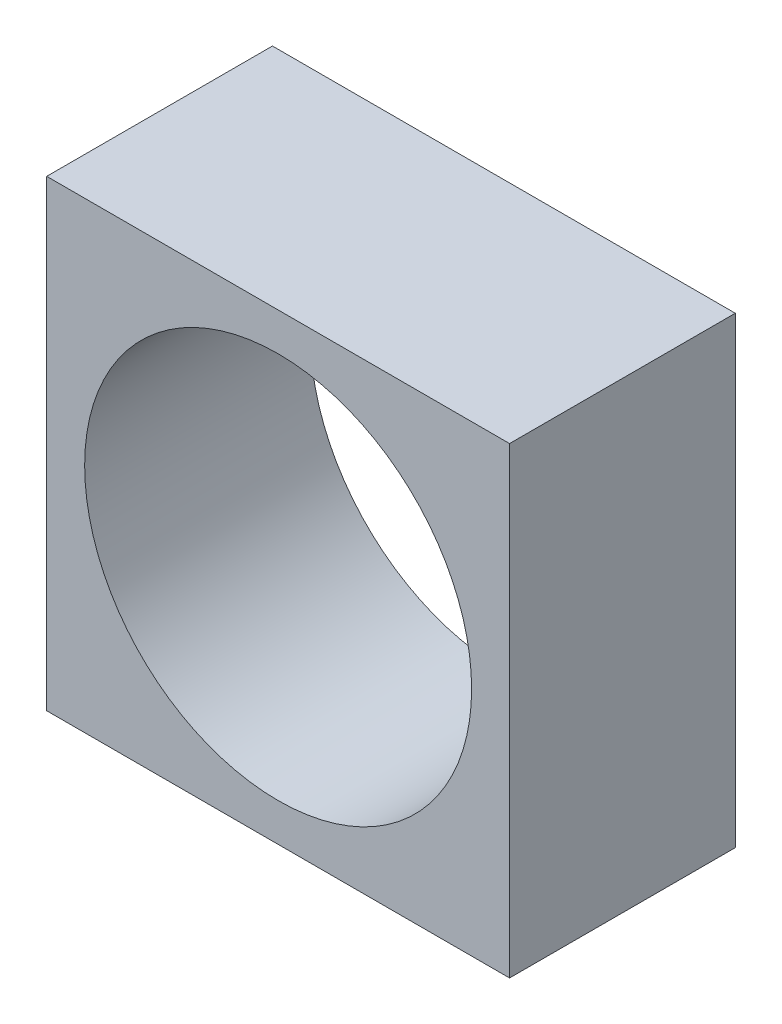
ISO-10303-21;
HEADER;
FILE_DESCRIPTION(('STEP AP214'),'2;1');
FILE_NAME('part.step','',(''),(''),'','','');
FILE_SCHEMA(('AUTOMOTIVE_DESIGN { 1 0 10303 214 1 1 1 1 }'));
ENDSEC;
DATA;
#1=APPLICATION_CONTEXT('core data for automotive mechanical design processes');
#2=APPLICATION_PROTOCOL_DEFINITION('international standard','automotive_design',2000,#1);
#3=PRODUCT_CONTEXT('',#1,'mechanical');
#4=PRODUCT('Part','Part','',(#3));
#5=PRODUCT_RELATED_PRODUCT_CATEGORY('part','',(#4));
#6=PRODUCT_DEFINITION_FORMATION('','',#4);
#7=PRODUCT_DEFINITION_CONTEXT('part definition',#1,'design');
#8=PRODUCT_DEFINITION('design','',#6,#7);
#9=PRODUCT_DEFINITION_SHAPE('','',#8);
#10=(LENGTH_UNIT() NAMED_UNIT(*) SI_UNIT(.MILLI.,.METRE.));
#11=(NAMED_UNIT(*) PLANE_ANGLE_UNIT() SI_UNIT($,.RADIAN.));
#12=(NAMED_UNIT(*) SI_UNIT($,.STERADIAN.) SOLID_ANGLE_UNIT());
#13=UNCERTAINTY_MEASURE_WITH_UNIT(LENGTH_MEASURE(1.E-05),#10,'distance_accuracy_value','');
#14=(GEOMETRIC_REPRESENTATION_CONTEXT(3) GLOBAL_UNCERTAINTY_ASSIGNED_CONTEXT((#13)) GLOBAL_UNIT_ASSIGNED_CONTEXT((#10,
#11,#12)) REPRESENTATION_CONTEXT('',''));
#15=CARTESIAN_POINT('',(0.,0.,0.));
#16=DIRECTION('',(0.,0.,1.));
#17=DIRECTION('',(1.,0.,0.));
#18=AXIS2_PLACEMENT_3D('',#15,#16,#17);
#19=CARTESIAN_POINT('',(0.,0.,2.975));
#20=DIRECTION('',(1.,0.,0.));
#21=DIRECTION('',(0.,0.,-1.));
#22=AXIS2_PLACEMENT_3D('',#19,#20,#21);
#23=PLANE('',#22);
#24=DIRECTION('',(0.,-1.,0.));
#25=VECTOR('',#24,1.);
#26=CARTESIAN_POINT('',(0.,0.,0.));
#27=LINE('',#26,#25);
#28=CARTESIAN_POINT('',(0.,6.1,0.));
#29=VERTEX_POINT('',#28);
#30=CARTESIAN_POINT('',(0.,0.,0.));
#31=VERTEX_POINT('',#30);
#32=EDGE_CURVE('E107',#29,#31,#27,.T.);
#33=ORIENTED_EDGE('',*,*,#32,.T.);
#34=DIRECTION('',(0.,0.,-1.));
#35=VECTOR('',#34,1.);
#36=CARTESIAN_POINT('',(0.,0.,2.975));
#37=LINE('',#36,#35);
#38=CARTESIAN_POINT('',(0.,0.,2.975));
#39=VERTEX_POINT('',#38);
#40=EDGE_CURVE('E11',#39,#31,#37,.T.);
#41=ORIENTED_EDGE('',*,*,#40,.F.);
#42=DIRECTION('',(0.,-1.,0.));
#43=VECTOR('',#42,1.);
#44=CARTESIAN_POINT('',(0.,0.,2.975));
#45=LINE('',#44,#43);
#46=CARTESIAN_POINT('',(0.,6.1,2.975));
#47=VERTEX_POINT('',#46);
#48=EDGE_CURVE('E91',#47,#39,#45,.T.);
#49=ORIENTED_EDGE('',*,*,#48,.F.);
#50=DIRECTION('',(0.,0.,-1.));
#51=VECTOR('',#50,1.);
#52=CARTESIAN_POINT('',(0.,6.1,2.975));
#53=LINE('',#52,#51);
#54=EDGE_CURVE('E103',#47,#29,#53,.T.);
#55=ORIENTED_EDGE('',*,*,#54,.T.);
#56=EDGE_LOOP('',(#33,#41,#49,#55));
#57=FACE_BOUND('',#56,.T.);
#58=ADVANCED_FACE('F39',(#57),#23,.F.);
#59=CARTESIAN_POINT('',(0.,0.,2.975));
#60=DIRECTION('',(0.,1.,0.));
#61=DIRECTION('',(0.,0.,1.));
#62=AXIS2_PLACEMENT_3D('',#59,#60,#61);
#63=PLANE('',#62);
#64=DIRECTION('',(1.,0.,0.));
#65=VECTOR('',#64,1.);
#66=CARTESIAN_POINT('',(0.,0.,0.));
#67=LINE('',#66,#65);
#68=CARTESIAN_POINT('',(6.1,0.,0.));
#69=VERTEX_POINT('',#68);
#70=EDGE_CURVE('E96',#31,#69,#67,.T.);
#71=ORIENTED_EDGE('',*,*,#70,.T.);
#72=DIRECTION('',(0.,0.,-1.));
#73=VECTOR('',#72,1.);
#74=CARTESIAN_POINT('',(6.1,0.,2.975));
#75=LINE('',#74,#73);
#76=CARTESIAN_POINT('',(6.1,0.,2.975));
#77=VERTEX_POINT('',#76);
#78=EDGE_CURVE('E48',#77,#69,#75,.T.);
#79=ORIENTED_EDGE('',*,*,#78,.F.);
#80=DIRECTION('',(1.,0.,0.));
#81=VECTOR('',#80,1.);
#82=CARTESIAN_POINT('',(0.,0.,2.975));
#83=LINE('',#82,#81);
#84=EDGE_CURVE('E86',#39,#77,#83,.T.);
#85=ORIENTED_EDGE('',*,*,#84,.F.);
#86=ORIENTED_EDGE('',*,*,#40,.T.);
#87=EDGE_LOOP('',(#71,#79,#85,#86));
#88=FACE_BOUND('',#87,.T.);
#89=ADVANCED_FACE('F95',(#88),#63,.F.);
#90=CARTESIAN_POINT('',(6.1,0.,2.975));
#91=DIRECTION('',(-1.,0.,0.));
#92=DIRECTION('',(0.,0.,1.));
#93=AXIS2_PLACEMENT_3D('',#90,#91,#92);
#94=PLANE('',#93);
#95=DIRECTION('',(0.,1.,0.));
#96=VECTOR('',#95,1.);
#97=CARTESIAN_POINT('',(6.1,0.,0.));
#98=LINE('',#97,#96);
#99=CARTESIAN_POINT('',(6.1,6.1,0.));
#100=VERTEX_POINT('',#99);
#101=EDGE_CURVE('E73',#69,#100,#98,.T.);
#102=ORIENTED_EDGE('',*,*,#101,.T.);
#103=DIRECTION('',(0.,0.,-1.));
#104=VECTOR('',#103,1.);
#105=CARTESIAN_POINT('',(6.1,6.1,2.975));
#106=LINE('',#105,#104);
#107=CARTESIAN_POINT('',(6.1,6.1,2.975));
#108=VERTEX_POINT('',#107);
#109=EDGE_CURVE('E98',#108,#100,#106,.T.);
#110=ORIENTED_EDGE('',*,*,#109,.F.);
#111=DIRECTION('',(0.,1.,0.));
#112=VECTOR('',#111,1.);
#113=CARTESIAN_POINT('',(6.1,0.,2.975));
#114=LINE('',#113,#112);
#115=EDGE_CURVE('E89',#77,#108,#114,.T.);
#116=ORIENTED_EDGE('',*,*,#115,.F.);
#117=ORIENTED_EDGE('',*,*,#78,.T.);
#118=EDGE_LOOP('',(#102,#110,#116,#117));
#119=FACE_BOUND('',#118,.T.);
#120=ADVANCED_FACE('F99',(#119),#94,.F.);
#121=CARTESIAN_POINT('',(0.,6.1,2.975));
#122=DIRECTION('',(0.,-1.,0.));
#123=DIRECTION('',(0.,0.,-1.));
#124=AXIS2_PLACEMENT_3D('',#121,#122,#123);
#125=PLANE('',#124);
#126=DIRECTION('',(-1.,0.,0.));
#127=VECTOR('',#126,1.);
#128=CARTESIAN_POINT('',(0.,6.1,0.));
#129=LINE('',#128,#127);
#130=EDGE_CURVE('E79',#100,#29,#129,.T.);
#131=ORIENTED_EDGE('',*,*,#130,.T.);
#132=ORIENTED_EDGE('',*,*,#54,.F.);
#133=DIRECTION('',(-1.,0.,0.));
#134=VECTOR('',#133,1.);
#135=CARTESIAN_POINT('',(0.,6.1,2.975));
#136=LINE('',#135,#134);
#137=EDGE_CURVE('E56',#108,#47,#136,.T.);
#138=ORIENTED_EDGE('',*,*,#137,.F.);
#139=ORIENTED_EDGE('',*,*,#109,.T.);
#140=EDGE_LOOP('',(#131,#132,#138,#139));
#141=FACE_BOUND('',#140,.T.);
#142=ADVANCED_FACE('F121',(#141),#125,.F.);
#143=CARTESIAN_POINT('',(0.,0.,2.975));
#144=DIRECTION('',(0.,0.,-1.));
#145=DIRECTION('',(-1.,0.,0.));
#146=AXIS2_PLACEMENT_3D('',#143,#144,#145);
#147=PLANE('',#146);
#148=CARTESIAN_POINT('',(3.05,3.05,2.975));
#149=DIRECTION('',(0.,0.,1.));
#150=DIRECTION('',(1.,0.,0.));
#151=AXIS2_PLACEMENT_3D('',#148,#149,#150);
#152=CIRCLE('',#151,2.55);
#153=CARTESIAN_POINT('',(5.6,3.05,2.975));
#154=VERTEX_POINT('',#153);
#155=EDGE_CURVE('E111',#154,#154,#152,.T.);
#156=ORIENTED_EDGE('',*,*,#155,.F.);
#157=EDGE_LOOP('',(#156));
#158=FACE_BOUND('',#157,.T.);
#159=ORIENTED_EDGE('',*,*,#48,.T.);
#160=ORIENTED_EDGE('',*,*,#84,.T.);
#161=ORIENTED_EDGE('',*,*,#115,.T.);
#162=ORIENTED_EDGE('',*,*,#137,.T.);
#163=EDGE_LOOP('',(#159,#160,#161,#162));
#164=FACE_BOUND('',#163,.T.);
#165=ADVANCED_FACE('F87',(#158,#164),#147,.F.);
#166=CARTESIAN_POINT('',(0.,0.,0.));
#167=DIRECTION('',(0.,0.,-1.));
#168=DIRECTION('',(-1.,0.,0.));
#169=AXIS2_PLACEMENT_3D('',#166,#167,#168);
#170=PLANE('',#169);
#171=CARTESIAN_POINT('',(3.05,3.05,0.));
#172=DIRECTION('',(0.,0.,-1.));
#173=DIRECTION('',(-1.,0.,0.));
#174=AXIS2_PLACEMENT_3D('',#171,#172,#173);
#175=CIRCLE('',#174,2.55);
#176=CARTESIAN_POINT('',(0.499999999999998,3.05,0.));
#177=VERTEX_POINT('',#176);
#178=EDGE_CURVE('E128',#177,#177,#175,.F.);
#179=ORIENTED_EDGE('',*,*,#178,.T.);
#180=EDGE_LOOP('',(#179));
#181=FACE_BOUND('',#180,.T.);
#182=ORIENTED_EDGE('',*,*,#32,.F.);
#183=ORIENTED_EDGE('',*,*,#130,.F.);
#184=ORIENTED_EDGE('',*,*,#101,.F.);
#185=ORIENTED_EDGE('',*,*,#70,.F.);
#186=EDGE_LOOP('',(#182,#183,#184,#185));
#187=FACE_BOUND('',#186,.T.);
#188=ADVANCED_FACE('F124',(#181,#187),#170,.T.);
#189=CARTESIAN_POINT('',(3.05,3.05,-0.00100000000000013));
#190=DIRECTION('',(0.,0.,1.));
#191=DIRECTION('',(1.,0.,0.));
#192=AXIS2_PLACEMENT_3D('',#189,#190,#191);
#193=CYLINDRICAL_SURFACE('',#192,2.55);
#194=ORIENTED_EDGE('',*,*,#178,.F.);
#195=EDGE_LOOP('',(#194));
#196=FACE_BOUND('',#195,.T.);
#197=ORIENTED_EDGE('',*,*,#155,.T.);
#198=EDGE_LOOP('',(#197));
#199=FACE_BOUND('',#198,.T.);
#200=ADVANCED_FACE('F136',(#196,#199),#193,.F.);
#201=CLOSED_SHELL('',(#58,#89,#120,#142,#165,#188,#200));
#202=MANIFOLD_SOLID_BREP('B2',#201);
#203=ADVANCED_BREP_SHAPE_REPRESENTATION('',(#18,#202),#14);
#204=SHAPE_DEFINITION_REPRESENTATION(#9,#203);
ENDSEC;
END-ISO-10303-21;
